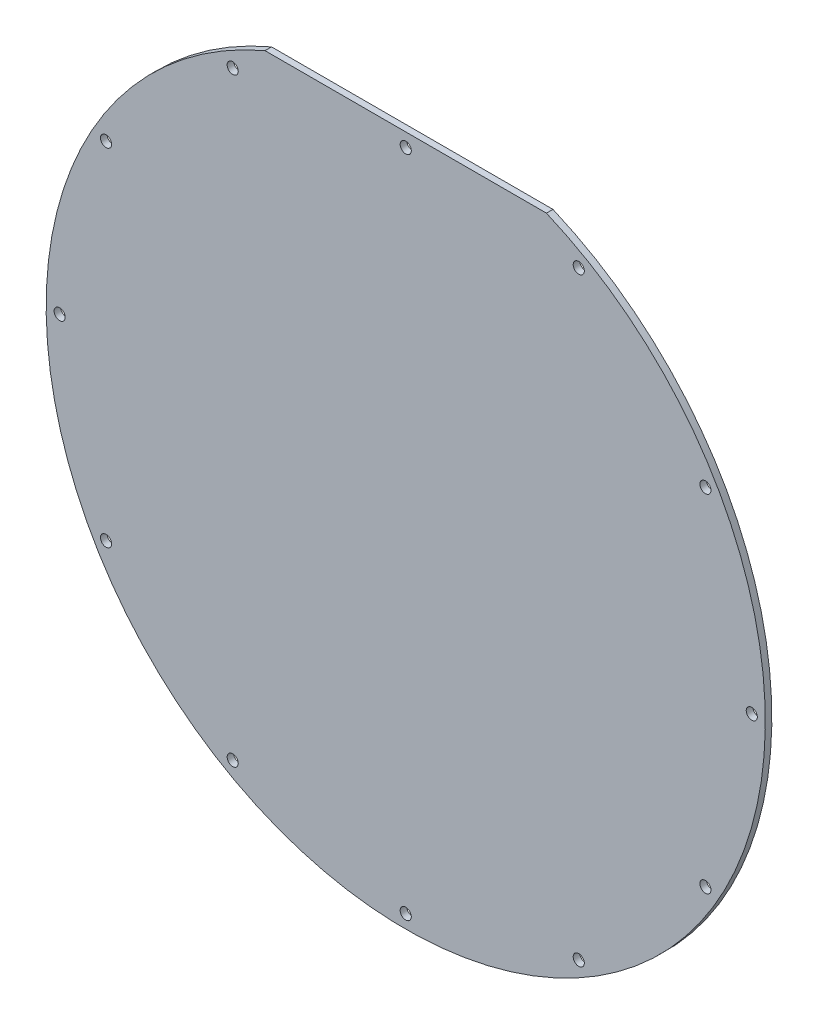
ISO-10303-21;
HEADER;
FILE_DESCRIPTION(('STEP AP214'),'2;1');
FILE_NAME('part.step','',(''),(''),'','','');
FILE_SCHEMA(('AUTOMOTIVE_DESIGN { 1 0 10303 214 1 1 1 1 }'));
ENDSEC;
DATA;
#1=APPLICATION_CONTEXT('core data for automotive mechanical design processes');
#2=APPLICATION_PROTOCOL_DEFINITION('international standard','automotive_design',2000,#1);
#3=PRODUCT_CONTEXT('',#1,'mechanical');
#4=PRODUCT('Part','Part','',(#3));
#5=PRODUCT_RELATED_PRODUCT_CATEGORY('part','',(#4));
#6=PRODUCT_DEFINITION_FORMATION('','',#4);
#7=PRODUCT_DEFINITION_CONTEXT('part definition',#1,'design');
#8=PRODUCT_DEFINITION('design','',#6,#7);
#9=PRODUCT_DEFINITION_SHAPE('','',#8);
#10=(LENGTH_UNIT() NAMED_UNIT(*) SI_UNIT(.MILLI.,.METRE.));
#11=(NAMED_UNIT(*) PLANE_ANGLE_UNIT() SI_UNIT($,.RADIAN.));
#12=(NAMED_UNIT(*) SI_UNIT($,.STERADIAN.) SOLID_ANGLE_UNIT());
#13=UNCERTAINTY_MEASURE_WITH_UNIT(LENGTH_MEASURE(1.E-05),#10,'distance_accuracy_value','');
#14=(GEOMETRIC_REPRESENTATION_CONTEXT(3) GLOBAL_UNCERTAINTY_ASSIGNED_CONTEXT((#13)) GLOBAL_UNIT_ASSIGNED_CONTEXT((#10,
#11,#12)) REPRESENTATION_CONTEXT('',''));
#15=CARTESIAN_POINT('',(0.,0.,0.));
#16=DIRECTION('',(0.,0.,1.));
#17=DIRECTION('',(1.,0.,0.));
#18=AXIS2_PLACEMENT_3D('',#15,#16,#17);
#19=CARTESIAN_POINT('',(27.3753029723745,-0.390966590115682,80.5143579066293));
#20=DIRECTION('',(0.,0.,-1.));
#21=DIRECTION('',(-1.,0.,0.));
#22=AXIS2_PLACEMENT_3D('',#19,#20,#21);
#23=CYLINDRICAL_SURFACE('',#22,110.020100000006);
#24=CARTESIAN_POINT('',(27.3753029723745,-0.390966590115682,78.5143579066293));
#25=DIRECTION('',(0.,0.,1.));
#26=DIRECTION('',(1.,0.,0.));
#27=AXIS2_PLACEMENT_3D('',#24,#25,#26);
#28=CIRCLE('',#27,110.020100000006);
#29=CARTESIAN_POINT('',(-15.678894122216,100.855063043403,78.5143579066293));
#30=VERTEX_POINT('',#29);
#31=CARTESIAN_POINT('',(70.4295000669651,100.855063043403,78.5143579066293));
#32=VERTEX_POINT('',#31);
#33=EDGE_CURVE('E50',#30,#32,#28,.T.);
#34=ORIENTED_EDGE('',*,*,#33,.T.);
#35=DIRECTION('',(0.,0.,-1.));
#36=VECTOR('',#35,1.);
#37=CARTESIAN_POINT('',(70.4295000669651,100.855063043403,80.5143579066293));
#38=LINE('',#37,#36);
#39=CARTESIAN_POINT('',(70.4295000669651,100.855063043403,80.5143579066293));
#40=VERTEX_POINT('',#39);
#41=EDGE_CURVE('E11',#40,#32,#38,.T.);
#42=ORIENTED_EDGE('',*,*,#41,.F.);
#43=CARTESIAN_POINT('',(27.3753029723745,-0.390966590115682,80.5143579066293));
#44=DIRECTION('',(0.,0.,1.));
#45=DIRECTION('',(1.,0.,0.));
#46=AXIS2_PLACEMENT_3D('',#43,#44,#45);
#47=CIRCLE('',#46,110.020100000006);
#48=CARTESIAN_POINT('',(-15.678894122216,100.855063043403,80.5143579066293));
#49=VERTEX_POINT('',#48);
#50=EDGE_CURVE('E49',#49,#40,#47,.T.);
#51=ORIENTED_EDGE('',*,*,#50,.F.);
#52=DIRECTION('',(0.,0.,-1.));
#53=VECTOR('',#52,1.);
#54=CARTESIAN_POINT('',(-15.678894122216,100.855063043403,80.5143579066293));
#55=LINE('',#54,#53);
#56=EDGE_CURVE('E26',#49,#30,#55,.T.);
#57=ORIENTED_EDGE('',*,*,#56,.T.);
#58=EDGE_LOOP('',(#34,#42,#51,#57));
#59=FACE_BOUND('',#58,.T.);
#60=ADVANCED_FACE('F17',(#59),#23,.T.);
#61=CARTESIAN_POINT('',(0.,100.855063043404,80.5143579066293));
#62=DIRECTION('',(0.,-1.,0.));
#63=DIRECTION('',(1.,0.,0.));
#64=AXIS2_PLACEMENT_3D('',#61,#62,#63);
#65=PLANE('',#64);
#66=DIRECTION('',(-1.,0.,0.));
#67=VECTOR('',#66,1.);
#68=CARTESIAN_POINT('',(0.,100.855063043404,78.5143579066293));
#69=LINE('',#68,#67);
#70=EDGE_CURVE('E42',#32,#30,#69,.T.);
#71=ORIENTED_EDGE('',*,*,#70,.T.);
#72=ORIENTED_EDGE('',*,*,#56,.F.);
#73=DIRECTION('',(-1.,0.,0.));
#74=VECTOR('',#73,1.);
#75=CARTESIAN_POINT('',(0.,100.855063043404,80.5143579066293));
#76=LINE('',#75,#74);
#77=EDGE_CURVE('E34',#40,#49,#76,.T.);
#78=ORIENTED_EDGE('',*,*,#77,.F.);
#79=ORIENTED_EDGE('',*,*,#41,.T.);
#80=EDGE_LOOP('',(#71,#72,#78,#79));
#81=FACE_BOUND('',#80,.T.);
#82=ADVANCED_FACE('F45',(#81),#65,.F.);
#83=CARTESIAN_POINT('',(0.,0.,80.5143579066293));
#84=DIRECTION('',(0.,0.,1.));
#85=DIRECTION('',(1.,0.,0.));
#86=AXIS2_PLACEMENT_3D('',#83,#84,#85);
#87=PLANE('',#86);
#88=CARTESIAN_POINT('',(80.3152529723753,91.3037165600399,80.5143579066293));
#89=DIRECTION('',(0.,0.,1.));
#90=DIRECTION('',(1.,0.,0.));
#91=AXIS2_PLACEMENT_3D('',#88,#89,#90);
#92=CIRCLE('',#91,1.7);
#93=CARTESIAN_POINT('',(82.0152529723753,91.3037165600399,80.5143579066293));
#94=VERTEX_POINT('',#93);
#95=EDGE_CURVE('E283',#94,#94,#92,.T.);
#96=ORIENTED_EDGE('',*,*,#95,.F.);
#97=EDGE_LOOP('',(#96));
#98=FACE_BOUND('',#97,.T.);
#99=CARTESIAN_POINT('',(27.375302979784,96.7148630434034,80.5143579066293));
#100=DIRECTION('',(0.,0.,1.));
#101=DIRECTION('',(1.,0.,0.));
#102=AXIS2_PLACEMENT_3D('',#99,#100,#101);
#103=CIRCLE('',#102,1.7);
#104=CARTESIAN_POINT('',(29.075302979784,96.7148630434034,80.5143579066293));
#105=VERTEX_POINT('',#104);
#106=EDGE_CURVE('E287',#105,#105,#103,.T.);
#107=ORIENTED_EDGE('',*,*,#106,.F.);
#108=EDGE_LOOP('',(#107));
#109=FACE_BOUND('',#108,.T.);
#110=CARTESIAN_POINT('',(-25.5646470276249,91.3037165600406,80.5143579066293));
#111=DIRECTION('',(0.,0.,1.));
#112=DIRECTION('',(1.,0.,0.));
#113=AXIS2_PLACEMENT_3D('',#110,#111,#112);
#114=CIRCLE('',#113,1.7);
#115=CARTESIAN_POINT('',(-23.8646470276249,91.3037165600406,80.5143579066293));
#116=VERTEX_POINT('',#115);
#117=EDGE_CURVE('E97',#116,#116,#114,.T.);
#118=ORIENTED_EDGE('',*,*,#117,.F.);
#119=EDGE_LOOP('',(#118));
#120=FACE_BOUND('',#119,.T.);
#121=CARTESIAN_POINT('',(-64.3193801777812,52.5489834098848,80.5143579066293));
#122=DIRECTION('',(0.,0.,1.));
#123=DIRECTION('',(1.,0.,0.));
#124=AXIS2_PLACEMENT_3D('',#121,#122,#123);
#125=CIRCLE('',#124,1.7);
#126=CARTESIAN_POINT('',(-62.6193801777812,52.5489834098848,80.5143579066293));
#127=VERTEX_POINT('',#126);
#128=EDGE_CURVE('E86',#127,#127,#125,.T.);
#129=ORIENTED_EDGE('',*,*,#128,.F.);
#130=EDGE_LOOP('',(#129));
#131=FACE_BOUND('',#130,.T.);
#132=CARTESIAN_POINT('',(-78.5045970276254,-0.390966590115303,80.5143579066293));
#133=DIRECTION('',(0.,0.,1.));
#134=DIRECTION('',(1.,0.,0.));
#135=AXIS2_PLACEMENT_3D('',#132,#133,#134);
#136=CIRCLE('',#135,1.7);
#137=CARTESIAN_POINT('',(-76.8045970276254,-0.390966590115303,80.5143579066293));
#138=VERTEX_POINT('',#137);
#139=EDGE_CURVE('E83',#138,#138,#136,.T.);
#140=ORIENTED_EDGE('',*,*,#139,.F.);
#141=EDGE_LOOP('',(#140));
#142=FACE_BOUND('',#141,.T.);
#143=CARTESIAN_POINT('',(-64.3193801777816,-53.3309165901155,80.5143579066293));
#144=DIRECTION('',(0.,0.,1.));
#145=DIRECTION('',(1.,0.,0.));
#146=AXIS2_PLACEMENT_3D('',#143,#144,#145);
#147=CIRCLE('',#146,1.7);
#148=CARTESIAN_POINT('',(-62.6193801777816,-53.3309165901155,80.5143579066293));
#149=VERTEX_POINT('',#148);
#150=EDGE_CURVE('E80',#149,#149,#147,.T.);
#151=ORIENTED_EDGE('',*,*,#150,.F.);
#152=EDGE_LOOP('',(#151));
#153=FACE_BOUND('',#152,.T.);
#154=CARTESIAN_POINT('',(-25.5646470276256,-92.0856497402716,80.5143579066293));
#155=DIRECTION('',(0.,0.,1.));
#156=DIRECTION('',(1.,0.,0.));
#157=AXIS2_PLACEMENT_3D('',#154,#155,#156);
#158=CIRCLE('',#157,1.7);
#159=CARTESIAN_POINT('',(-23.8646470276256,-92.0856497402716,80.5143579066293));
#160=VERTEX_POINT('',#159);
#161=EDGE_CURVE('E79',#160,#160,#158,.T.);
#162=ORIENTED_EDGE('',*,*,#161,.F.);
#163=EDGE_LOOP('',(#162));
#164=FACE_BOUND('',#163,.T.);
#165=CARTESIAN_POINT('',(27.3753029723745,-106.270866590116,80.5143579066293));
#166=DIRECTION('',(0.,0.,1.));
#167=DIRECTION('',(1.,0.,0.));
#168=AXIS2_PLACEMENT_3D('',#165,#166,#167);
#169=CIRCLE('',#168,1.7);
#170=CARTESIAN_POINT('',(29.0753029723746,-106.270866590116,80.5143579066293));
#171=VERTEX_POINT('',#170);
#172=EDGE_CURVE('E75',#171,#171,#169,.T.);
#173=ORIENTED_EDGE('',*,*,#172,.F.);
#174=EDGE_LOOP('',(#173));
#175=FACE_BOUND('',#174,.T.);
#176=CARTESIAN_POINT('',(80.3152529723734,-92.0856497402723,80.5143579066293));
#177=DIRECTION('',(0.,0.,1.));
#178=DIRECTION('',(1.,0.,0.));
#179=AXIS2_PLACEMENT_3D('',#176,#177,#178);
#180=CIRCLE('',#179,1.7);
#181=CARTESIAN_POINT('',(82.0152529723734,-92.0856497402723,80.5143579066293));
#182=VERTEX_POINT('',#181);
#183=EDGE_CURVE('E71',#182,#182,#180,.T.);
#184=ORIENTED_EDGE('',*,*,#183,.F.);
#185=EDGE_LOOP('',(#184));
#186=FACE_BOUND('',#185,.T.);
#187=CARTESIAN_POINT('',(119.06998612253,-53.3309165901167,80.5143579066293));
#188=DIRECTION('',(0.,0.,1.));
#189=DIRECTION('',(1.,0.,0.));
#190=AXIS2_PLACEMENT_3D('',#187,#188,#189);
#191=CIRCLE('',#190,1.7);
#192=CARTESIAN_POINT('',(120.76998612253,-53.3309165901167,80.5143579066293));
#193=VERTEX_POINT('',#192);
#194=EDGE_CURVE('E70',#193,#193,#191,.T.);
#195=ORIENTED_EDGE('',*,*,#194,.F.);
#196=EDGE_LOOP('',(#195));
#197=FACE_BOUND('',#196,.T.);
#198=CARTESIAN_POINT('',(133.255202972374,-0.390966590116781,80.5143579066293));
#199=DIRECTION('',(0.,0.,1.));
#200=DIRECTION('',(1.,0.,0.));
#201=AXIS2_PLACEMENT_3D('',#198,#199,#200);
#202=CIRCLE('',#201,1.7);
#203=CARTESIAN_POINT('',(134.955202972374,-0.390966590116781,80.5143579066293));
#204=VERTEX_POINT('',#203);
#205=EDGE_CURVE('E66',#204,#204,#202,.T.);
#206=ORIENTED_EDGE('',*,*,#205,.F.);
#207=EDGE_LOOP('',(#206));
#208=FACE_BOUND('',#207,.T.);
#209=CARTESIAN_POINT('',(119.069986122531,52.5489834098835,80.5143579066293));
#210=DIRECTION('',(0.,0.,1.));
#211=DIRECTION('',(1.,0.,0.));
#212=AXIS2_PLACEMENT_3D('',#209,#210,#211);
#213=CIRCLE('',#212,1.7);
#214=CARTESIAN_POINT('',(120.769986122531,52.5489834098835,80.5143579066293));
#215=VERTEX_POINT('',#214);
#216=EDGE_CURVE('E58',#215,#215,#213,.T.);
#217=ORIENTED_EDGE('',*,*,#216,.F.);
#218=EDGE_LOOP('',(#217));
#219=FACE_BOUND('',#218,.T.);
#220=ORIENTED_EDGE('',*,*,#50,.T.);
#221=ORIENTED_EDGE('',*,*,#77,.T.);
#222=EDGE_LOOP('',(#220,#221));
#223=FACE_BOUND('',#222,.T.);
#224=ADVANCED_FACE('F120',(#98,#109,#120,#131,#142,#153,#164,#175,#186,#197,#208,#219,#223),#87,.T.);
#225=CARTESIAN_POINT('',(0.,0.,78.5143579066293));
#226=DIRECTION('',(0.,0.,1.));
#227=DIRECTION('',(1.,0.,0.));
#228=AXIS2_PLACEMENT_3D('',#225,#226,#227);
#229=PLANE('',#228);
#230=CARTESIAN_POINT('',(80.3152529723753,91.3037165600399,78.5143579066293));
#231=DIRECTION('',(0.,0.,1.));
#232=DIRECTION('',(1.,0.,0.));
#233=AXIS2_PLACEMENT_3D('',#230,#231,#232);
#234=CIRCLE('',#233,1.7);
#235=CARTESIAN_POINT('',(82.0152529723753,91.3037165600399,78.5143579066293));
#236=VERTEX_POINT('',#235);
#237=EDGE_CURVE('E286',#236,#236,#234,.T.);
#238=ORIENTED_EDGE('',*,*,#237,.T.);
#239=EDGE_LOOP('',(#238));
#240=FACE_BOUND('',#239,.T.);
#241=CARTESIAN_POINT('',(27.375302979784,96.7148630434034,78.5143579066293));
#242=DIRECTION('',(0.,0.,1.));
#243=DIRECTION('',(1.,0.,0.));
#244=AXIS2_PLACEMENT_3D('',#241,#242,#243);
#245=CIRCLE('',#244,1.7);
#246=CARTESIAN_POINT('',(29.075302979784,96.7148630434034,78.5143579066293));
#247=VERTEX_POINT('',#246);
#248=EDGE_CURVE('E20',#247,#247,#245,.T.);
#249=ORIENTED_EDGE('',*,*,#248,.T.);
#250=EDGE_LOOP('',(#249));
#251=FACE_BOUND('',#250,.T.);
#252=CARTESIAN_POINT('',(-25.5646470276249,91.3037165600406,78.5143579066293));
#253=DIRECTION('',(0.,0.,1.));
#254=DIRECTION('',(1.,0.,0.));
#255=AXIS2_PLACEMENT_3D('',#252,#253,#254);
#256=CIRCLE('',#255,1.7);
#257=CARTESIAN_POINT('',(-23.8646470276249,91.3037165600406,78.5143579066293));
#258=VERTEX_POINT('',#257);
#259=EDGE_CURVE('E92',#258,#258,#256,.T.);
#260=ORIENTED_EDGE('',*,*,#259,.T.);
#261=EDGE_LOOP('',(#260));
#262=FACE_BOUND('',#261,.T.);
#263=CARTESIAN_POINT('',(-64.3193801777812,52.5489834098848,78.5143579066293));
#264=DIRECTION('',(0.,0.,1.));
#265=DIRECTION('',(1.,0.,0.));
#266=AXIS2_PLACEMENT_3D('',#263,#264,#265);
#267=CIRCLE('',#266,1.7);
#268=CARTESIAN_POINT('',(-62.6193801777812,52.5489834098848,78.5143579066293));
#269=VERTEX_POINT('',#268);
#270=EDGE_CURVE('E84',#269,#269,#267,.T.);
#271=ORIENTED_EDGE('',*,*,#270,.T.);
#272=EDGE_LOOP('',(#271));
#273=FACE_BOUND('',#272,.T.);
#274=CARTESIAN_POINT('',(-78.5045970276254,-0.390966590115303,78.5143579066293));
#275=DIRECTION('',(0.,0.,1.));
#276=DIRECTION('',(1.,0.,0.));
#277=AXIS2_PLACEMENT_3D('',#274,#275,#276);
#278=CIRCLE('',#277,1.7);
#279=CARTESIAN_POINT('',(-76.8045970276254,-0.390966590115303,78.5143579066293));
#280=VERTEX_POINT('',#279);
#281=EDGE_CURVE('E81',#280,#280,#278,.T.);
#282=ORIENTED_EDGE('',*,*,#281,.T.);
#283=EDGE_LOOP('',(#282));
#284=FACE_BOUND('',#283,.T.);
#285=CARTESIAN_POINT('',(-64.3193801777816,-53.3309165901155,78.5143579066293));
#286=DIRECTION('',(0.,0.,1.));
#287=DIRECTION('',(1.,0.,0.));
#288=AXIS2_PLACEMENT_3D('',#285,#286,#287);
#289=CIRCLE('',#288,1.7);
#290=CARTESIAN_POINT('',(-62.6193801777816,-53.3309165901155,78.5143579066293));
#291=VERTEX_POINT('',#290);
#292=EDGE_CURVE('E76',#291,#291,#289,.T.);
#293=ORIENTED_EDGE('',*,*,#292,.T.);
#294=EDGE_LOOP('',(#293));
#295=FACE_BOUND('',#294,.T.);
#296=CARTESIAN_POINT('',(-25.5646470276256,-92.0856497402716,78.5143579066293));
#297=DIRECTION('',(0.,0.,1.));
#298=DIRECTION('',(1.,0.,0.));
#299=AXIS2_PLACEMENT_3D('',#296,#297,#298);
#300=CIRCLE('',#299,1.7);
#301=CARTESIAN_POINT('',(-23.8646470276256,-92.0856497402716,78.5143579066293));
#302=VERTEX_POINT('',#301);
#303=EDGE_CURVE('E105',#302,#302,#300,.T.);
#304=ORIENTED_EDGE('',*,*,#303,.T.);
#305=EDGE_LOOP('',(#304));
#306=FACE_BOUND('',#305,.T.);
#307=CARTESIAN_POINT('',(27.3753029723745,-106.270866590116,78.5143579066293));
#308=DIRECTION('',(0.,0.,1.));
#309=DIRECTION('',(1.,0.,0.));
#310=AXIS2_PLACEMENT_3D('',#307,#308,#309);
#311=CIRCLE('',#310,1.7);
#312=CARTESIAN_POINT('',(29.0753029723746,-106.270866590116,78.5143579066293));
#313=VERTEX_POINT('',#312);
#314=EDGE_CURVE('E72',#313,#313,#311,.T.);
#315=ORIENTED_EDGE('',*,*,#314,.T.);
#316=EDGE_LOOP('',(#315));
#317=FACE_BOUND('',#316,.T.);
#318=CARTESIAN_POINT('',(80.3152529723734,-92.0856497402723,78.5143579066293));
#319=DIRECTION('',(0.,0.,1.));
#320=DIRECTION('',(1.,0.,0.));
#321=AXIS2_PLACEMENT_3D('',#318,#319,#320);
#322=CIRCLE('',#321,1.7);
#323=CARTESIAN_POINT('',(82.0152529723734,-92.0856497402723,78.5143579066293));
#324=VERTEX_POINT('',#323);
#325=EDGE_CURVE('E67',#324,#324,#322,.T.);
#326=ORIENTED_EDGE('',*,*,#325,.T.);
#327=EDGE_LOOP('',(#326));
#328=FACE_BOUND('',#327,.T.);
#329=CARTESIAN_POINT('',(119.06998612253,-53.3309165901167,78.5143579066293));
#330=DIRECTION('',(0.,0.,1.));
#331=DIRECTION('',(1.,0.,0.));
#332=AXIS2_PLACEMENT_3D('',#329,#330,#331);
#333=CIRCLE('',#332,1.7);
#334=CARTESIAN_POINT('',(120.76998612253,-53.3309165901167,78.5143579066293));
#335=VERTEX_POINT('',#334);
#336=EDGE_CURVE('E114',#335,#335,#333,.T.);
#337=ORIENTED_EDGE('',*,*,#336,.T.);
#338=EDGE_LOOP('',(#337));
#339=FACE_BOUND('',#338,.T.);
#340=CARTESIAN_POINT('',(133.255202972374,-0.390966590116781,78.5143579066293));
#341=DIRECTION('',(0.,0.,1.));
#342=DIRECTION('',(1.,0.,0.));
#343=AXIS2_PLACEMENT_3D('',#340,#341,#342);
#344=CIRCLE('',#343,1.7);
#345=CARTESIAN_POINT('',(134.955202972374,-0.390966590116781,78.5143579066293));
#346=VERTEX_POINT('',#345);
#347=EDGE_CURVE('E63',#346,#346,#344,.T.);
#348=ORIENTED_EDGE('',*,*,#347,.T.);
#349=EDGE_LOOP('',(#348));
#350=FACE_BOUND('',#349,.T.);
#351=CARTESIAN_POINT('',(119.069986122531,52.5489834098835,78.5143579066293));
#352=DIRECTION('',(0.,0.,1.));
#353=DIRECTION('',(1.,0.,0.));
#354=AXIS2_PLACEMENT_3D('',#351,#352,#353);
#355=CIRCLE('',#354,1.7);
#356=CARTESIAN_POINT('',(120.769986122531,52.5489834098835,78.5143579066293));
#357=VERTEX_POINT('',#356);
#358=EDGE_CURVE('E55',#357,#357,#355,.T.);
#359=ORIENTED_EDGE('',*,*,#358,.T.);
#360=EDGE_LOOP('',(#359));
#361=FACE_BOUND('',#360,.T.);
#362=ORIENTED_EDGE('',*,*,#33,.F.);
#363=ORIENTED_EDGE('',*,*,#70,.F.);
#364=EDGE_LOOP('',(#362,#363));
#365=FACE_BOUND('',#364,.T.);
#366=ADVANCED_FACE('F54',(#240,#251,#262,#273,#284,#295,#306,#317,#328,#339,#350,#361,#365),
#229,.F.);
#367=CARTESIAN_POINT('',(119.069986122531,52.5489834098835,80.5143579066293));
#368=DIRECTION('',(0.,0.,1.));
#369=DIRECTION('',(1.,0.,0.));
#370=AXIS2_PLACEMENT_3D('',#367,#368,#369);
#371=CYLINDRICAL_SURFACE('',#370,1.7);
#372=ORIENTED_EDGE('',*,*,#216,.T.);
#373=EDGE_LOOP('',(#372));
#374=FACE_BOUND('',#373,.T.);
#375=ORIENTED_EDGE('',*,*,#358,.F.);
#376=EDGE_LOOP('',(#375));
#377=FACE_BOUND('',#376,.T.);
#378=ADVANCED_FACE('F130',(#374,#377),#371,.F.);
#379=CARTESIAN_POINT('',(133.255202972374,-0.390966590116781,80.5143579066293));
#380=DIRECTION('',(0.,0.,1.));
#381=DIRECTION('',(1.,0.,0.));
#382=AXIS2_PLACEMENT_3D('',#379,#380,#381);
#383=CYLINDRICAL_SURFACE('',#382,1.7);
#384=ORIENTED_EDGE('',*,*,#205,.T.);
#385=EDGE_LOOP('',(#384));
#386=FACE_BOUND('',#385,.T.);
#387=ORIENTED_EDGE('',*,*,#347,.F.);
#388=EDGE_LOOP('',(#387));
#389=FACE_BOUND('',#388,.T.);
#390=ADVANCED_FACE('F167',(#386,#389),#383,.F.);
#391=CARTESIAN_POINT('',(119.06998612253,-53.3309165901167,80.5143579066293));
#392=DIRECTION('',(0.,0.,1.));
#393=DIRECTION('',(1.,0.,0.));
#394=AXIS2_PLACEMENT_3D('',#391,#392,#393);
#395=CYLINDRICAL_SURFACE('',#394,1.7);
#396=ORIENTED_EDGE('',*,*,#194,.T.);
#397=EDGE_LOOP('',(#396));
#398=FACE_BOUND('',#397,.T.);
#399=ORIENTED_EDGE('',*,*,#336,.F.);
#400=EDGE_LOOP('',(#399));
#401=FACE_BOUND('',#400,.T.);
#402=ADVANCED_FACE('F176',(#398,#401),#395,.F.);
#403=CARTESIAN_POINT('',(80.3152529723734,-92.0856497402723,80.5143579066293));
#404=DIRECTION('',(0.,0.,1.));
#405=DIRECTION('',(1.,0.,0.));
#406=AXIS2_PLACEMENT_3D('',#403,#404,#405);
#407=CYLINDRICAL_SURFACE('',#406,1.7);
#408=ORIENTED_EDGE('',*,*,#183,.T.);
#409=EDGE_LOOP('',(#408));
#410=FACE_BOUND('',#409,.T.);
#411=ORIENTED_EDGE('',*,*,#325,.F.);
#412=EDGE_LOOP('',(#411));
#413=FACE_BOUND('',#412,.T.);
#414=ADVANCED_FACE('F186',(#410,#413),#407,.F.);
#415=CARTESIAN_POINT('',(27.3753029723745,-106.270866590116,80.5143579066293));
#416=DIRECTION('',(0.,0.,1.));
#417=DIRECTION('',(1.,0.,0.));
#418=AXIS2_PLACEMENT_3D('',#415,#416,#417);
#419=CYLINDRICAL_SURFACE('',#418,1.7);
#420=ORIENTED_EDGE('',*,*,#172,.T.);
#421=EDGE_LOOP('',(#420));
#422=FACE_BOUND('',#421,.T.);
#423=ORIENTED_EDGE('',*,*,#314,.F.);
#424=EDGE_LOOP('',(#423));
#425=FACE_BOUND('',#424,.T.);
#426=ADVANCED_FACE('F196',(#422,#425),#419,.F.);
#427=CARTESIAN_POINT('',(-25.5646470276256,-92.0856497402716,80.5143579066293));
#428=DIRECTION('',(0.,0.,1.));
#429=DIRECTION('',(1.,0.,0.));
#430=AXIS2_PLACEMENT_3D('',#427,#428,#429);
#431=CYLINDRICAL_SURFACE('',#430,1.7);
#432=ORIENTED_EDGE('',*,*,#161,.T.);
#433=EDGE_LOOP('',(#432));
#434=FACE_BOUND('',#433,.T.);
#435=ORIENTED_EDGE('',*,*,#303,.F.);
#436=EDGE_LOOP('',(#435));
#437=FACE_BOUND('',#436,.T.);
#438=ADVANCED_FACE('F206',(#434,#437),#431,.F.);
#439=CARTESIAN_POINT('',(-64.3193801777816,-53.3309165901155,80.5143579066293));
#440=DIRECTION('',(0.,0.,1.));
#441=DIRECTION('',(1.,0.,0.));
#442=AXIS2_PLACEMENT_3D('',#439,#440,#441);
#443=CYLINDRICAL_SURFACE('',#442,1.7);
#444=ORIENTED_EDGE('',*,*,#150,.T.);
#445=EDGE_LOOP('',(#444));
#446=FACE_BOUND('',#445,.T.);
#447=ORIENTED_EDGE('',*,*,#292,.F.);
#448=EDGE_LOOP('',(#447));
#449=FACE_BOUND('',#448,.T.);
#450=ADVANCED_FACE('F216',(#446,#449),#443,.F.);
#451=CARTESIAN_POINT('',(-78.5045970276254,-0.390966590115303,80.5143579066293));
#452=DIRECTION('',(0.,0.,1.));
#453=DIRECTION('',(1.,0.,0.));
#454=AXIS2_PLACEMENT_3D('',#451,#452,#453);
#455=CYLINDRICAL_SURFACE('',#454,1.7);
#456=ORIENTED_EDGE('',*,*,#139,.T.);
#457=EDGE_LOOP('',(#456));
#458=FACE_BOUND('',#457,.T.);
#459=ORIENTED_EDGE('',*,*,#281,.F.);
#460=EDGE_LOOP('',(#459));
#461=FACE_BOUND('',#460,.T.);
#462=ADVANCED_FACE('F226',(#458,#461),#455,.F.);
#463=CARTESIAN_POINT('',(-64.3193801777812,52.5489834098848,80.5143579066293));
#464=DIRECTION('',(0.,0.,1.));
#465=DIRECTION('',(1.,0.,0.));
#466=AXIS2_PLACEMENT_3D('',#463,#464,#465);
#467=CYLINDRICAL_SURFACE('',#466,1.7);
#468=ORIENTED_EDGE('',*,*,#128,.T.);
#469=EDGE_LOOP('',(#468));
#470=FACE_BOUND('',#469,.T.);
#471=ORIENTED_EDGE('',*,*,#270,.F.);
#472=EDGE_LOOP('',(#471));
#473=FACE_BOUND('',#472,.T.);
#474=ADVANCED_FACE('F236',(#470,#473),#467,.F.);
#475=CARTESIAN_POINT('',(-25.5646470276249,91.3037165600406,80.5143579066293));
#476=DIRECTION('',(0.,0.,1.));
#477=DIRECTION('',(1.,0.,0.));
#478=AXIS2_PLACEMENT_3D('',#475,#476,#477);
#479=CYLINDRICAL_SURFACE('',#478,1.7);
#480=ORIENTED_EDGE('',*,*,#117,.T.);
#481=EDGE_LOOP('',(#480));
#482=FACE_BOUND('',#481,.T.);
#483=ORIENTED_EDGE('',*,*,#259,.F.);
#484=EDGE_LOOP('',(#483));
#485=FACE_BOUND('',#484,.T.);
#486=ADVANCED_FACE('F246',(#482,#485),#479,.F.);
#487=CARTESIAN_POINT('',(27.375302979784,96.7148630434034,80.5143579066293));
#488=DIRECTION('',(0.,0.,1.));
#489=DIRECTION('',(1.,0.,0.));
#490=AXIS2_PLACEMENT_3D('',#487,#488,#489);
#491=CYLINDRICAL_SURFACE('',#490,1.7);
#492=ORIENTED_EDGE('',*,*,#106,.T.);
#493=EDGE_LOOP('',(#492));
#494=FACE_BOUND('',#493,.T.);
#495=ORIENTED_EDGE('',*,*,#248,.F.);
#496=EDGE_LOOP('',(#495));
#497=FACE_BOUND('',#496,.T.);
#498=ADVANCED_FACE('F255',(#494,#497),#491,.F.);
#499=CARTESIAN_POINT('',(80.3152529723753,91.3037165600399,80.5143579066293));
#500=DIRECTION('',(0.,0.,1.));
#501=DIRECTION('',(1.,0.,0.));
#502=AXIS2_PLACEMENT_3D('',#499,#500,#501);
#503=CYLINDRICAL_SURFACE('',#502,1.7);
#504=ORIENTED_EDGE('',*,*,#95,.T.);
#505=EDGE_LOOP('',(#504));
#506=FACE_BOUND('',#505,.T.);
#507=ORIENTED_EDGE('',*,*,#237,.F.);
#508=EDGE_LOOP('',(#507));
#509=FACE_BOUND('',#508,.T.);
#510=ADVANCED_FACE('F265',(#506,#509),#503,.F.);
#511=CLOSED_SHELL('',(#60,#82,#224,#366,#378,#390,#402,#414,#426,#438,#450,#462,#474,#486,#498,#510));
#512=MANIFOLD_SOLID_BREP('B1',#511);
#513=ADVANCED_BREP_SHAPE_REPRESENTATION('',(#18,#512),#14);
#514=SHAPE_DEFINITION_REPRESENTATION(#9,#513);
ENDSEC;
END-ISO-10303-21;
